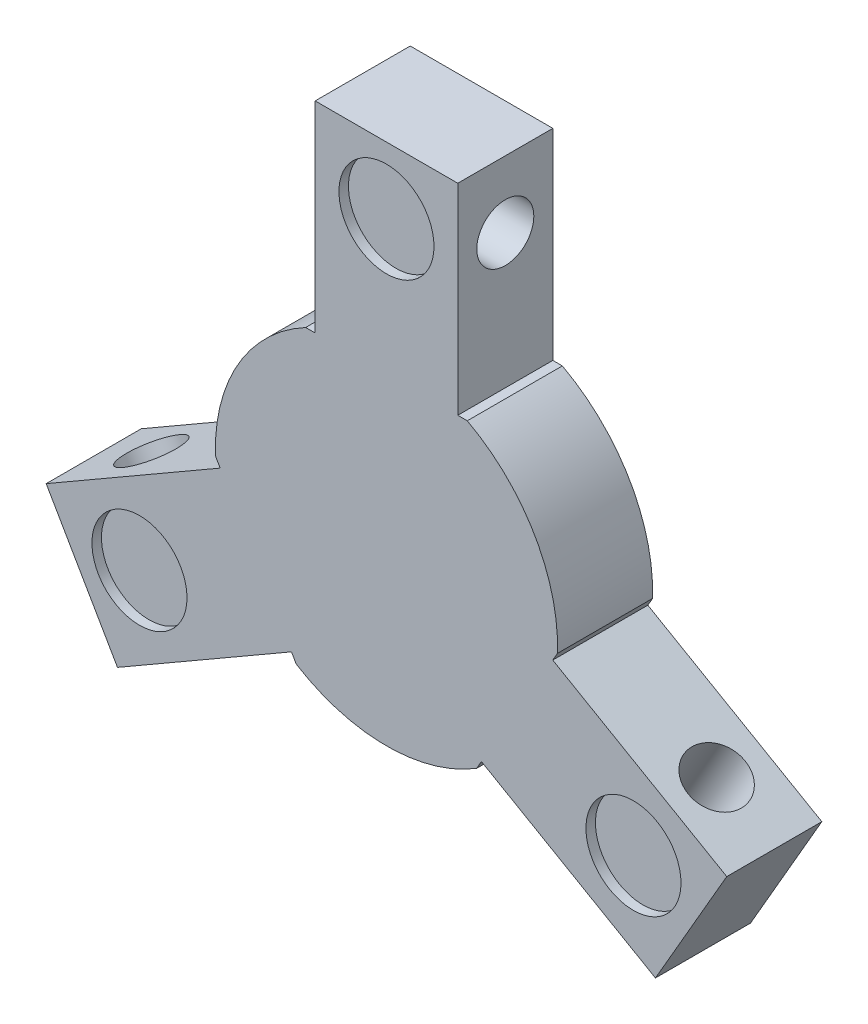
ISO-10303-21;
HEADER;
FILE_DESCRIPTION(('STEP AP214'),'2;1');
FILE_NAME('part.step','',(''),(''),'','','');
FILE_SCHEMA(('AUTOMOTIVE_DESIGN { 1 0 10303 214 1 1 1 1 }'));
ENDSEC;
DATA;
#1=APPLICATION_CONTEXT('core data for automotive mechanical design processes');
#2=APPLICATION_PROTOCOL_DEFINITION('international standard','automotive_design',2000,#1);
#3=PRODUCT_CONTEXT('',#1,'mechanical');
#4=PRODUCT('Part','Part','',(#3));
#5=PRODUCT_RELATED_PRODUCT_CATEGORY('part','',(#4));
#6=PRODUCT_DEFINITION_FORMATION('','',#4);
#7=PRODUCT_DEFINITION_CONTEXT('part definition',#1,'design');
#8=PRODUCT_DEFINITION('design','',#6,#7);
#9=PRODUCT_DEFINITION_SHAPE('','',#8);
#10=(LENGTH_UNIT() NAMED_UNIT(*) SI_UNIT(.MILLI.,.METRE.));
#11=(NAMED_UNIT(*) PLANE_ANGLE_UNIT() SI_UNIT($,.RADIAN.));
#12=(NAMED_UNIT(*) SI_UNIT($,.STERADIAN.) SOLID_ANGLE_UNIT());
#13=UNCERTAINTY_MEASURE_WITH_UNIT(LENGTH_MEASURE(1.E-05),#10,'distance_accuracy_value','');
#14=(GEOMETRIC_REPRESENTATION_CONTEXT(3) GLOBAL_UNCERTAINTY_ASSIGNED_CONTEXT((#13)) GLOBAL_UNIT_ASSIGNED_CONTEXT((#10,
#11,#12)) REPRESENTATION_CONTEXT('',''));
#15=CARTESIAN_POINT('',(0.,0.,0.));
#16=DIRECTION('',(0.,0.,1.));
#17=DIRECTION('',(1.,0.,0.));
#18=AXIS2_PLACEMENT_3D('',#15,#16,#17);
#19=CARTESIAN_POINT('',(0.,0.,5.));
#20=DIRECTION('',(0.,0.,-1.));
#21=DIRECTION('',(-1.,0.,0.));
#22=AXIS2_PLACEMENT_3D('',#19,#20,#21);
#23=CYLINDRICAL_SURFACE('',#22,9.);
#24=CARTESIAN_POINT('',(0.,0.,0.));
#25=DIRECTION('',(0.,0.,1.));
#26=DIRECTION('',(1.,0.,0.));
#27=AXIS2_PLACEMENT_3D('',#24,#25,#26);
#28=CIRCLE('',#27,9.);
#29=CARTESIAN_POINT('',(8.99545304183064,-0.286049947071782,0.));
#30=VERTEX_POINT('',#29);
#31=CARTESIAN_POINT('',(4.25,7.93331582631121,0.));
#32=VERTEX_POINT('',#31);
#33=EDGE_CURVE('E315',#30,#32,#28,.T.);
#34=ORIENTED_EDGE('',*,*,#33,.T.);
#35=DIRECTION('',(0.,0.,1.));
#36=VECTOR('',#35,1.);
#37=CARTESIAN_POINT('',(4.25,7.93331582631121,-5.));
#38=LINE('',#37,#36);
#39=CARTESIAN_POINT('',(4.25,7.93331582631121,5.));
#40=VERTEX_POINT('',#39);
#41=EDGE_CURVE('E301',#32,#40,#38,.T.);
#42=ORIENTED_EDGE('',*,*,#41,.T.);
#43=CARTESIAN_POINT('',(0.,0.,5.));
#44=DIRECTION('',(0.,0.,1.));
#45=DIRECTION('',(1.,0.,0.));
#46=AXIS2_PLACEMENT_3D('',#43,#44,#45);
#47=CIRCLE('',#46,9.);
#48=CARTESIAN_POINT('',(8.99545304183064,-0.286049947071782,5.));
#49=VERTEX_POINT('',#48);
#50=EDGE_CURVE('E316',#49,#40,#47,.T.);
#51=ORIENTED_EDGE('',*,*,#50,.F.);
#52=DIRECTION('',(0.,0.,1.));
#53=VECTOR('',#52,1.);
#54=CARTESIAN_POINT('',(8.99545304183064,-0.286049947071782,-5.));
#55=LINE('',#54,#53);
#56=EDGE_CURVE('E308',#30,#49,#55,.T.);
#57=ORIENTED_EDGE('',*,*,#56,.F.);
#58=EDGE_LOOP('',(#34,#42,#51,#57));
#59=FACE_BOUND('',#58,.T.);
#60=ADVANCED_FACE('F37',(#59),#23,.T.);
#61=CARTESIAN_POINT('',(0.,0.,5.));
#62=DIRECTION('',(0.,0.,-1.));
#63=DIRECTION('',(-1.,0.,0.));
#64=AXIS2_PLACEMENT_3D('',#61,#62,#63);
#65=CYLINDRICAL_SURFACE('',#64,9.);
#66=CARTESIAN_POINT('',(0.,0.,0.));
#67=DIRECTION('',(0.,0.,1.));
#68=DIRECTION('',(1.,0.,0.));
#69=AXIS2_PLACEMENT_3D('',#66,#67,#68);
#70=CIRCLE('',#69,9.);
#71=CARTESIAN_POINT('',(-4.25,7.93331582631121,0.));
#72=VERTEX_POINT('',#71);
#73=CARTESIAN_POINT('',(-8.99545304183065,-0.286049947071653,0.));
#74=VERTEX_POINT('',#73);
#75=EDGE_CURVE('E324',#72,#74,#70,.T.);
#76=ORIENTED_EDGE('',*,*,#75,.T.);
#77=DIRECTION('',(0.,0.,1.));
#78=VECTOR('',#77,1.);
#79=CARTESIAN_POINT('',(-8.99545304183065,-0.286049947071653,-5.));
#80=LINE('',#79,#78);
#81=CARTESIAN_POINT('',(-8.99545304183065,-0.286049947071653,5.));
#82=VERTEX_POINT('',#81);
#83=EDGE_CURVE('E305',#74,#82,#80,.T.);
#84=ORIENTED_EDGE('',*,*,#83,.T.);
#85=CARTESIAN_POINT('',(0.,0.,5.));
#86=DIRECTION('',(0.,0.,1.));
#87=DIRECTION('',(1.,0.,0.));
#88=AXIS2_PLACEMENT_3D('',#85,#86,#87);
#89=CIRCLE('',#88,9.);
#90=CARTESIAN_POINT('',(-4.25,7.93331582631121,5.));
#91=VERTEX_POINT('',#90);
#92=EDGE_CURVE('E45',#91,#82,#89,.T.);
#93=ORIENTED_EDGE('',*,*,#92,.F.);
#94=DIRECTION('',(0.,0.,1.));
#95=VECTOR('',#94,1.);
#96=CARTESIAN_POINT('',(-4.25,7.93331582631121,-5.));
#97=LINE('',#96,#95);
#98=EDGE_CURVE('E304',#72,#91,#97,.T.);
#99=ORIENTED_EDGE('',*,*,#98,.F.);
#100=EDGE_LOOP('',(#76,#84,#93,#99));
#101=FACE_BOUND('',#100,.T.);
#102=ADVANCED_FACE('F366',(#101),#65,.T.);
#103=CARTESIAN_POINT('',(0.,0.,5.));
#104=DIRECTION('',(0.,0.,-1.));
#105=DIRECTION('',(-1.,0.,0.));
#106=AXIS2_PLACEMENT_3D('',#103,#104,#105);
#107=CYLINDRICAL_SURFACE('',#106,9.);
#108=CARTESIAN_POINT('',(0.,0.,0.));
#109=DIRECTION('',(0.,0.,1.));
#110=DIRECTION('',(1.,0.,0.));
#111=AXIS2_PLACEMENT_3D('',#108,#109,#110);
#112=CIRCLE('',#111,9.);
#113=CARTESIAN_POINT('',(-4.74545304183072,-7.64726587923942,0.));
#114=VERTEX_POINT('',#113);
#115=CARTESIAN_POINT('',(4.74545304183061,-7.64726587923949,0.));
#116=VERTEX_POINT('',#115);
#117=EDGE_CURVE('E319',#114,#116,#112,.T.);
#118=ORIENTED_EDGE('',*,*,#117,.T.);
#119=DIRECTION('',(0.,0.,1.));
#120=VECTOR('',#119,1.);
#121=CARTESIAN_POINT('',(4.74545304183061,-7.64726587923949,-5.));
#122=LINE('',#121,#120);
#123=CARTESIAN_POINT('',(4.74545304183061,-7.64726587923949,5.));
#124=VERTEX_POINT('',#123);
#125=EDGE_CURVE('E310',#116,#124,#122,.T.);
#126=ORIENTED_EDGE('',*,*,#125,.T.);
#127=CARTESIAN_POINT('',(0.,0.,5.));
#128=DIRECTION('',(0.,0.,1.));
#129=DIRECTION('',(1.,0.,0.));
#130=AXIS2_PLACEMENT_3D('',#127,#128,#129);
#131=CIRCLE('',#130,9.);
#132=CARTESIAN_POINT('',(-4.74545304183072,-7.64726587923942,5.));
#133=VERTEX_POINT('',#132);
#134=EDGE_CURVE('E11',#133,#124,#131,.T.);
#135=ORIENTED_EDGE('',*,*,#134,.F.);
#136=DIRECTION('',(0.,0.,1.));
#137=VECTOR('',#136,1.);
#138=CARTESIAN_POINT('',(-4.74545304183072,-7.64726587923942,-5.));
#139=LINE('',#138,#137);
#140=EDGE_CURVE('E285',#114,#133,#139,.T.);
#141=ORIENTED_EDGE('',*,*,#140,.F.);
#142=EDGE_LOOP('',(#118,#126,#135,#141));
#143=FACE_BOUND('',#142,.T.);
#144=ADVANCED_FACE('F371',(#143),#107,.T.);
#145=CARTESIAN_POINT('',(0.,0.,5.));
#146=DIRECTION('',(0.,0.,1.));
#147=DIRECTION('',(1.,0.,0.));
#148=AXIS2_PLACEMENT_3D('',#145,#146,#147);
#149=PLANE('',#148);
#150=DIRECTION('',(-0.500000000000004,-0.866025403784436,0.));
#151=VECTOR('',#150,1.);
#152=CARTESIAN_POINT('',(8.74545304183064,-0.719062648964,5.));
#153=LINE('',#152,#151);
#154=CARTESIAN_POINT('',(8.74545304183064,-0.719062648964,5.));
#155=VERTEX_POINT('',#154);
#156=EDGE_CURVE('E217',#49,#155,#153,.T.);
#157=ORIENTED_EDGE('',*,*,#156,.F.);
#158=ORIENTED_EDGE('',*,*,#50,.T.);
#159=DIRECTION('',(1.,0.,0.));
#160=VECTOR('',#159,1.);
#161=CARTESIAN_POINT('',(4.25,7.93331582631121,5.));
#162=LINE('',#161,#160);
#163=CARTESIAN_POINT('',(3.75,7.93331582631121,5.));
#164=VERTEX_POINT('',#163);
#165=EDGE_CURVE('E261',#164,#40,#162,.T.);
#166=ORIENTED_EDGE('',*,*,#165,.F.);
#167=DIRECTION('',(0.,-1.,0.));
#168=VECTOR('',#167,1.);
#169=CARTESIAN_POINT('',(3.75,18.0033147735479,5.));
#170=LINE('',#169,#168);
#171=CARTESIAN_POINT('',(3.75,18.5033147735479,5.));
#172=VERTEX_POINT('',#171);
#173=EDGE_CURVE('E264',#172,#164,#170,.T.);
#174=ORIENTED_EDGE('',*,*,#173,.F.);
#175=DIRECTION('',(-1.,0.,0.));
#176=VECTOR('',#175,1.);
#177=CARTESIAN_POINT('',(-3.75,18.5033147735479,5.));
#178=LINE('',#177,#176);
#179=CARTESIAN_POINT('',(-3.75,18.5033147735479,5.));
#180=VERTEX_POINT('',#179);
#181=EDGE_CURVE('E205',#172,#180,#178,.T.);
#182=ORIENTED_EDGE('',*,*,#181,.T.);
#183=DIRECTION('',(0.,1.,0.));
#184=VECTOR('',#183,1.);
#185=CARTESIAN_POINT('',(-3.75,7.93331582631121,5.));
#186=LINE('',#185,#184);
#187=CARTESIAN_POINT('',(-3.75,7.93331582631121,5.));
#188=VERTEX_POINT('',#187);
#189=EDGE_CURVE('E249',#188,#180,#186,.T.);
#190=ORIENTED_EDGE('',*,*,#189,.F.);
#191=DIRECTION('',(1.,0.,0.));
#192=VECTOR('',#191,1.);
#193=CARTESIAN_POINT('',(-3.75,7.93331582631121,5.));
#194=LINE('',#193,#192);
#195=EDGE_CURVE('E251',#91,#188,#194,.T.);
#196=ORIENTED_EDGE('',*,*,#195,.F.);
#197=ORIENTED_EDGE('',*,*,#92,.T.);
#198=DIRECTION('',(-0.499999999999994,0.866025403784442,0.));
#199=VECTOR('',#198,1.);
#200=CARTESIAN_POINT('',(-8.74545304183065,-0.719062648963874,5.));
#201=LINE('',#200,#199);
#202=CARTESIAN_POINT('',(-8.74545304183065,-0.719062648963874,5.));
#203=VERTEX_POINT('',#202);
#204=EDGE_CURVE('E224',#203,#82,#201,.T.);
#205=ORIENTED_EDGE('',*,*,#204,.F.);
#206=DIRECTION('',(0.866025403784443,0.499999999999992,0.));
#207=VECTOR('',#206,1.);
#208=CARTESIAN_POINT('',(-17.4634572681199,-5.75240473580819,5.));
#209=LINE('',#208,#207);
#210=CARTESIAN_POINT('',(-17.8964699700122,-6.00240473580819,5.));
#211=VERTEX_POINT('',#210);
#212=EDGE_CURVE('E228',#211,#203,#209,.T.);
#213=ORIENTED_EDGE('',*,*,#212,.F.);
#214=DIRECTION('',(0.499999999999992,-0.866025403784443,0.));
#215=VECTOR('',#214,1.);
#216=CARTESIAN_POINT('',(-17.8964699700122,-6.00240473580819,5.));
#217=LINE('',#216,#215);
#218=CARTESIAN_POINT('',(-14.1464699700122,-12.4975952641915,5.));
#219=VERTEX_POINT('',#218);
#220=EDGE_CURVE('E194',#211,#219,#217,.T.);
#221=ORIENTED_EDGE('',*,*,#220,.T.);
#222=DIRECTION('',(-0.866025403784443,-0.499999999999992,0.));
#223=VECTOR('',#222,1.);
#224=CARTESIAN_POINT('',(-4.99545304183071,-7.2142531773472,5.));
#225=LINE('',#224,#223);
#226=CARTESIAN_POINT('',(-4.99545304183071,-7.2142531773472,5.));
#227=VERTEX_POINT('',#226);
#228=EDGE_CURVE('E237',#227,#219,#225,.T.);
#229=ORIENTED_EDGE('',*,*,#228,.F.);
#230=DIRECTION('',(-0.499999999999992,0.866025403784443,0.));
#231=VECTOR('',#230,1.);
#232=CARTESIAN_POINT('',(-4.74545304183072,-7.64726587923942,5.));
#233=LINE('',#232,#231);
#234=EDGE_CURVE('E239',#133,#227,#233,.T.);
#235=ORIENTED_EDGE('',*,*,#234,.F.);
#236=ORIENTED_EDGE('',*,*,#134,.T.);
#237=DIRECTION('',(-0.500000000000003,-0.866025403784437,0.));
#238=VECTOR('',#237,1.);
#239=CARTESIAN_POINT('',(4.99545304183061,-7.21425317734727,5.));
#240=LINE('',#239,#238);
#241=CARTESIAN_POINT('',(4.99545304183061,-7.21425317734727,5.));
#242=VERTEX_POINT('',#241);
#243=EDGE_CURVE('E176',#242,#124,#240,.T.);
#244=ORIENTED_EDGE('',*,*,#243,.F.);
#245=DIRECTION('',(-0.866025403784436,0.500000000000004,0.));
#246=VECTOR('',#245,1.);
#247=CARTESIAN_POINT('',(13.7134572681198,-12.2475952641917,5.));
#248=LINE('',#247,#246);
#249=CARTESIAN_POINT('',(14.1464699700121,-12.4975952641917,5.));
#250=VERTEX_POINT('',#249);
#251=EDGE_CURVE('E234',#250,#242,#248,.T.);
#252=ORIENTED_EDGE('',*,*,#251,.F.);
#253=DIRECTION('',(0.500000000000005,0.866025403784435,0.));
#254=VECTOR('',#253,1.);
#255=CARTESIAN_POINT('',(17.8964699700121,-6.00240473580845,5.));
#256=LINE('',#255,#254);
#257=CARTESIAN_POINT('',(17.8964699700121,-6.00240473580845,5.));
#258=VERTEX_POINT('',#257);
#259=EDGE_CURVE('E184',#250,#258,#256,.T.);
#260=ORIENTED_EDGE('',*,*,#259,.T.);
#261=DIRECTION('',(0.866025403784436,-0.500000000000004,0.));
#262=VECTOR('',#261,1.);
#263=CARTESIAN_POINT('',(8.74545304183064,-0.719062648964,5.));
#264=LINE('',#263,#262);
#265=EDGE_CURVE('E271',#155,#258,#264,.T.);
#266=ORIENTED_EDGE('',*,*,#265,.F.);
#267=EDGE_LOOP('',(#157,#158,#166,#174,#182,#190,#196,#197,#205,#213,#221,#229,#235,#236,#244,
#252,#260,#266));
#268=FACE_BOUND('',#267,.T.);
#269=CARTESIAN_POINT('',(0.,15.,5.));
#270=DIRECTION('',(0.,0.,1.));
#271=DIRECTION('',(1.,0.,0.));
#272=AXIS2_PLACEMENT_3D('',#269,#270,#271);
#273=CIRCLE('',#272,2.5);
#274=CARTESIAN_POINT('',(2.5,15.,5.));
#275=VERTEX_POINT('',#274);
#276=EDGE_CURVE('E286',#275,#275,#273,.T.);
#277=ORIENTED_EDGE('',*,*,#276,.F.);
#278=EDGE_LOOP('',(#277));
#279=FACE_BOUND('',#278,.T.);
#280=CARTESIAN_POINT('',(12.9903810567665,-7.50000000000006,5.));
#281=DIRECTION('',(0.,0.,1.));
#282=DIRECTION('',(1.,0.,0.));
#283=AXIS2_PLACEMENT_3D('',#280,#281,#282);
#284=CIRCLE('',#283,2.5);
#285=CARTESIAN_POINT('',(15.4903810567665,-7.50000000000006,5.));
#286=VERTEX_POINT('',#285);
#287=EDGE_CURVE('E292',#286,#286,#284,.T.);
#288=ORIENTED_EDGE('',*,*,#287,.F.);
#289=EDGE_LOOP('',(#288));
#290=FACE_BOUND('',#289,.T.);
#291=CARTESIAN_POINT('',(-12.9903810567667,-7.49999999999988,5.));
#292=DIRECTION('',(0.,0.,1.));
#293=DIRECTION('',(1.,0.,0.));
#294=AXIS2_PLACEMENT_3D('',#291,#292,#293);
#295=CIRCLE('',#294,2.5);
#296=CARTESIAN_POINT('',(-10.4903810567667,-7.49999999999988,5.));
#297=VERTEX_POINT('',#296);
#298=EDGE_CURVE('E298',#297,#297,#295,.T.);
#299=ORIENTED_EDGE('',*,*,#298,.F.);
#300=EDGE_LOOP('',(#299));
#301=FACE_BOUND('',#300,.T.);
#302=ADVANCED_FACE('F380',(#268,#279,#290,#301),#149,.T.);
#303=CARTESIAN_POINT('',(0.,0.,0.));
#304=DIRECTION('',(0.,0.,1.));
#305=DIRECTION('',(1.,0.,0.));
#306=AXIS2_PLACEMENT_3D('',#303,#304,#305);
#307=PLANE('',#306);
#308=ORIENTED_EDGE('',*,*,#33,.F.);
#309=DIRECTION('',(-0.500000000000004,-0.866025403784436,0.));
#310=VECTOR('',#309,1.);
#311=CARTESIAN_POINT('',(8.74545304183064,-0.719062648964,0.));
#312=LINE('',#311,#310);
#313=CARTESIAN_POINT('',(8.74545304183064,-0.719062648964,0.));
#314=VERTEX_POINT('',#313);
#315=EDGE_CURVE('E61',#30,#314,#312,.T.);
#316=ORIENTED_EDGE('',*,*,#315,.T.);
#317=DIRECTION('',(0.866025403784436,-0.500000000000004,0.));
#318=VECTOR('',#317,1.);
#319=CARTESIAN_POINT('',(8.74545304183064,-0.719062648964,0.));
#320=LINE('',#319,#318);
#321=CARTESIAN_POINT('',(17.8964699700121,-6.00240473580845,0.));
#322=VERTEX_POINT('',#321);
#323=EDGE_CURVE('E189',#314,#322,#320,.T.);
#324=ORIENTED_EDGE('',*,*,#323,.T.);
#325=DIRECTION('',(0.500000000000005,0.866025403784435,0.));
#326=VECTOR('',#325,1.);
#327=CARTESIAN_POINT('',(17.8964699700121,-6.00240473580845,0.));
#328=LINE('',#327,#326);
#329=CARTESIAN_POINT('',(14.1464699700121,-12.4975952641917,0.));
#330=VERTEX_POINT('',#329);
#331=EDGE_CURVE('E182',#330,#322,#328,.T.);
#332=ORIENTED_EDGE('',*,*,#331,.F.);
#333=DIRECTION('',(-0.866025403784436,0.500000000000004,0.));
#334=VECTOR('',#333,1.);
#335=CARTESIAN_POINT('',(13.7134572681198,-12.2475952641917,0.));
#336=LINE('',#335,#334);
#337=CARTESIAN_POINT('',(4.99545304183061,-7.21425317734727,0.));
#338=VERTEX_POINT('',#337);
#339=EDGE_CURVE('E163',#330,#338,#336,.T.);
#340=ORIENTED_EDGE('',*,*,#339,.T.);
#341=DIRECTION('',(-0.500000000000003,-0.866025403784437,0.));
#342=VECTOR('',#341,1.);
#343=CARTESIAN_POINT('',(4.99545304183061,-7.21425317734727,0.));
#344=LINE('',#343,#342);
#345=EDGE_CURVE('E175',#338,#116,#344,.T.);
#346=ORIENTED_EDGE('',*,*,#345,.T.);
#347=ORIENTED_EDGE('',*,*,#117,.F.);
#348=DIRECTION('',(-0.499999999999992,0.866025403784443,0.));
#349=VECTOR('',#348,1.);
#350=CARTESIAN_POINT('',(-4.74545304183072,-7.64726587923942,0.));
#351=LINE('',#350,#349);
#352=CARTESIAN_POINT('',(-4.99545304183071,-7.2142531773472,0.));
#353=VERTEX_POINT('',#352);
#354=EDGE_CURVE('E53',#114,#353,#351,.T.);
#355=ORIENTED_EDGE('',*,*,#354,.T.);
#356=DIRECTION('',(-0.866025403784443,-0.499999999999992,0.));
#357=VECTOR('',#356,1.);
#358=CARTESIAN_POINT('',(-4.99545304183071,-7.2142531773472,0.));
#359=LINE('',#358,#357);
#360=CARTESIAN_POINT('',(-14.1464699700122,-12.4975952641915,0.));
#361=VERTEX_POINT('',#360);
#362=EDGE_CURVE('E236',#353,#361,#359,.T.);
#363=ORIENTED_EDGE('',*,*,#362,.T.);
#364=DIRECTION('',(0.499999999999992,-0.866025403784443,0.));
#365=VECTOR('',#364,1.);
#366=CARTESIAN_POINT('',(-17.8964699700122,-6.00240473580819,0.));
#367=LINE('',#366,#365);
#368=CARTESIAN_POINT('',(-17.8964699700122,-6.00240473580819,0.));
#369=VERTEX_POINT('',#368);
#370=EDGE_CURVE('E196',#369,#361,#367,.T.);
#371=ORIENTED_EDGE('',*,*,#370,.F.);
#372=DIRECTION('',(0.866025403784443,0.499999999999992,0.));
#373=VECTOR('',#372,1.);
#374=CARTESIAN_POINT('',(-17.4634572681199,-5.75240473580819,0.));
#375=LINE('',#374,#373);
#376=CARTESIAN_POINT('',(-8.74545304183065,-0.719062648963874,0.));
#377=VERTEX_POINT('',#376);
#378=EDGE_CURVE('E220',#369,#377,#375,.T.);
#379=ORIENTED_EDGE('',*,*,#378,.T.);
#380=DIRECTION('',(-0.499999999999994,0.866025403784442,0.));
#381=VECTOR('',#380,1.);
#382=CARTESIAN_POINT('',(-8.74545304183065,-0.719062648963874,0.));
#383=LINE('',#382,#381);
#384=EDGE_CURVE('E223',#377,#74,#383,.T.);
#385=ORIENTED_EDGE('',*,*,#384,.T.);
#386=ORIENTED_EDGE('',*,*,#75,.F.);
#387=DIRECTION('',(1.,0.,0.));
#388=VECTOR('',#387,1.);
#389=CARTESIAN_POINT('',(-3.75,7.93331582631121,0.));
#390=LINE('',#389,#388);
#391=CARTESIAN_POINT('',(-3.75,7.93331582631121,0.));
#392=VERTEX_POINT('',#391);
#393=EDGE_CURVE('E245',#72,#392,#390,.T.);
#394=ORIENTED_EDGE('',*,*,#393,.T.);
#395=DIRECTION('',(0.,1.,0.));
#396=VECTOR('',#395,1.);
#397=CARTESIAN_POINT('',(-3.75,7.93331582631121,0.));
#398=LINE('',#397,#396);
#399=CARTESIAN_POINT('',(-3.75,18.5033147735479,0.));
#400=VERTEX_POINT('',#399);
#401=EDGE_CURVE('E248',#392,#400,#398,.T.);
#402=ORIENTED_EDGE('',*,*,#401,.T.);
#403=DIRECTION('',(-1.,0.,0.));
#404=VECTOR('',#403,1.);
#405=CARTESIAN_POINT('',(-3.75,18.5033147735479,0.));
#406=LINE('',#405,#404);
#407=CARTESIAN_POINT('',(3.75,18.5033147735479,0.));
#408=VERTEX_POINT('',#407);
#409=EDGE_CURVE('E208',#408,#400,#406,.T.);
#410=ORIENTED_EDGE('',*,*,#409,.F.);
#411=DIRECTION('',(0.,-1.,0.));
#412=VECTOR('',#411,1.);
#413=CARTESIAN_POINT('',(3.75,18.0033147735479,0.));
#414=LINE('',#413,#412);
#415=CARTESIAN_POINT('',(3.75,7.93331582631121,0.));
#416=VERTEX_POINT('',#415);
#417=EDGE_CURVE('E257',#408,#416,#414,.T.);
#418=ORIENTED_EDGE('',*,*,#417,.T.);
#419=DIRECTION('',(1.,0.,0.));
#420=VECTOR('',#419,1.);
#421=CARTESIAN_POINT('',(4.25,7.93331582631121,0.));
#422=LINE('',#421,#420);
#423=EDGE_CURVE('E260',#416,#32,#422,.T.);
#424=ORIENTED_EDGE('',*,*,#423,.T.);
#425=EDGE_LOOP('',(#308,#316,#324,#332,#340,#346,#347,#355,#363,#371,#379,#385,#386,#394,#402,
#410,#418,#424));
#426=FACE_BOUND('',#425,.T.);
#427=ADVANCED_FACE('F187',(#426),#307,.F.);
#428=CARTESIAN_POINT('',(-12.9903810567667,-7.49999999999988,4.5));
#429=DIRECTION('',(0.,0.,1.));
#430=DIRECTION('',(1.,0.,0.));
#431=AXIS2_PLACEMENT_3D('',#428,#429,#430);
#432=CYLINDRICAL_SURFACE('',#431,2.5);
#433=CARTESIAN_POINT('',(-12.9903810567667,-7.49999999999988,4.5));
#434=DIRECTION('',(0.,0.,1.));
#435=DIRECTION('',(1.,0.,0.));
#436=AXIS2_PLACEMENT_3D('',#433,#434,#435);
#437=CIRCLE('',#436,2.5);
#438=CARTESIAN_POINT('',(-10.4903810567667,-7.49999999999988,4.5));
#439=VERTEX_POINT('',#438);
#440=EDGE_CURVE('E295',#439,#439,#437,.T.);
#441=ORIENTED_EDGE('',*,*,#440,.F.);
#442=EDGE_LOOP('',(#441));
#443=FACE_BOUND('',#442,.T.);
#444=ORIENTED_EDGE('',*,*,#298,.T.);
#445=EDGE_LOOP('',(#444));
#446=FACE_BOUND('',#445,.T.);
#447=ADVANCED_FACE('F477',(#443,#446),#432,.F.);
#448=CARTESIAN_POINT('',(-12.9903810567667,-7.49999999999988,4.5));
#449=DIRECTION('',(0.,0.,1.));
#450=DIRECTION('',(1.,0.,0.));
#451=AXIS2_PLACEMENT_3D('',#448,#449,#450);
#452=PLANE('',#451);
#453=ORIENTED_EDGE('',*,*,#440,.T.);
#454=EDGE_LOOP('',(#453));
#455=FACE_BOUND('',#454,.T.);
#456=ADVANCED_FACE('F473',(#455),#452,.T.);
#457=CARTESIAN_POINT('',(12.9903810567665,-7.50000000000006,4.5));
#458=DIRECTION('',(0.,0.,1.));
#459=DIRECTION('',(1.,0.,0.));
#460=AXIS2_PLACEMENT_3D('',#457,#458,#459);
#461=CYLINDRICAL_SURFACE('',#460,2.5);
#462=CARTESIAN_POINT('',(12.9903810567665,-7.50000000000006,4.5));
#463=DIRECTION('',(0.,0.,1.));
#464=DIRECTION('',(1.,0.,0.));
#465=AXIS2_PLACEMENT_3D('',#462,#463,#464);
#466=CIRCLE('',#465,2.5);
#467=CARTESIAN_POINT('',(15.4903810567665,-7.50000000000006,4.5));
#468=VERTEX_POINT('',#467);
#469=EDGE_CURVE('E289',#468,#468,#466,.T.);
#470=ORIENTED_EDGE('',*,*,#469,.F.);
#471=EDGE_LOOP('',(#470));
#472=FACE_BOUND('',#471,.T.);
#473=ORIENTED_EDGE('',*,*,#287,.T.);
#474=EDGE_LOOP('',(#473));
#475=FACE_BOUND('',#474,.T.);
#476=ADVANCED_FACE('F469',(#472,#475),#461,.F.);
#477=CARTESIAN_POINT('',(12.9903810567665,-7.50000000000006,4.5));
#478=DIRECTION('',(0.,0.,1.));
#479=DIRECTION('',(1.,0.,0.));
#480=AXIS2_PLACEMENT_3D('',#477,#478,#479);
#481=PLANE('',#480);
#482=ORIENTED_EDGE('',*,*,#469,.T.);
#483=EDGE_LOOP('',(#482));
#484=FACE_BOUND('',#483,.T.);
#485=ADVANCED_FACE('F465',(#484),#481,.T.);
#486=CARTESIAN_POINT('',(0.,15.,4.5));
#487=DIRECTION('',(0.,0.,1.));
#488=DIRECTION('',(1.,0.,0.));
#489=AXIS2_PLACEMENT_3D('',#486,#487,#488);
#490=CYLINDRICAL_SURFACE('',#489,2.5);
#491=CARTESIAN_POINT('',(0.,15.,4.5));
#492=DIRECTION('',(0.,0.,1.));
#493=DIRECTION('',(1.,0.,0.));
#494=AXIS2_PLACEMENT_3D('',#491,#492,#493);
#495=CIRCLE('',#494,2.5);
#496=CARTESIAN_POINT('',(2.5,15.,4.5));
#497=VERTEX_POINT('',#496);
#498=EDGE_CURVE('E282',#497,#497,#495,.T.);
#499=ORIENTED_EDGE('',*,*,#498,.F.);
#500=EDGE_LOOP('',(#499));
#501=FACE_BOUND('',#500,.T.);
#502=ORIENTED_EDGE('',*,*,#276,.T.);
#503=EDGE_LOOP('',(#502));
#504=FACE_BOUND('',#503,.T.);
#505=ADVANCED_FACE('F461',(#501,#504),#490,.F.);
#506=CARTESIAN_POINT('',(0.,15.,4.5));
#507=DIRECTION('',(0.,0.,1.));
#508=DIRECTION('',(1.,0.,0.));
#509=AXIS2_PLACEMENT_3D('',#506,#507,#508);
#510=PLANE('',#509);
#511=ORIENTED_EDGE('',*,*,#498,.T.);
#512=EDGE_LOOP('',(#511));
#513=FACE_BOUND('',#512,.T.);
#514=ADVANCED_FACE('F441',(#513),#510,.T.);
#515=CARTESIAN_POINT('',(-17.4634572681199,-5.75240473580819,0.));
#516=DIRECTION('',(0.499999999999992,-0.866025403784443,0.));
#517=DIRECTION('',(0.866025403784443,0.499999999999992,0.));
#518=AXIS2_PLACEMENT_3D('',#515,#516,#517);
#519=PLANE('',#518);
#520=ORIENTED_EDGE('',*,*,#212,.T.);
#521=DIRECTION('',(0.,0.,1.));
#522=VECTOR('',#521,1.);
#523=CARTESIAN_POINT('',(-8.74545304183065,-0.719062648963874,0.));
#524=LINE('',#523,#522);
#525=EDGE_CURVE('E227',#377,#203,#524,.T.);
#526=ORIENTED_EDGE('',*,*,#525,.F.);
#527=ORIENTED_EDGE('',*,*,#378,.F.);
#528=DIRECTION('',(0.,0.,1.));
#529=VECTOR('',#528,1.);
#530=CARTESIAN_POINT('',(-17.8964699700122,-6.00240473580819,0.));
#531=LINE('',#530,#529);
#532=EDGE_CURVE('E199',#369,#211,#531,.T.);
#533=ORIENTED_EDGE('',*,*,#532,.T.);
#534=EDGE_LOOP('',(#520,#526,#527,#533));
#535=FACE_BOUND('',#534,.T.);
#536=CARTESIAN_POINT('',(-14.8653810567666,-4.25240473580822,2.5));
#537=DIRECTION('',(0.499999999999992,-0.866025403784443,0.));
#538=DIRECTION('',(0.866025403784443,0.499999999999992,0.));
#539=AXIS2_PLACEMENT_3D('',#536,#537,#538);
#540=CIRCLE('',#539,1.5);
#541=CARTESIAN_POINT('',(-13.56634295109,-3.50240473580823,2.5));
#542=VERTEX_POINT('',#541);
#543=EDGE_CURVE('E281',#542,#542,#540,.F.);
#544=ORIENTED_EDGE('',*,*,#543,.F.);
#545=EDGE_LOOP('',(#544));
#546=FACE_BOUND('',#545,.T.);
#547=ADVANCED_FACE('F409',(#535,#546),#519,.F.);
#548=CARTESIAN_POINT('',(-8.74545304183065,-0.719062648963874,0.));
#549=DIRECTION('',(0.866025403784442,0.499999999999994,0.));
#550=DIRECTION('',(-0.499999999999994,0.866025403784442,0.));
#551=AXIS2_PLACEMENT_3D('',#548,#549,#550);
#552=PLANE('',#551);
#553=ORIENTED_EDGE('',*,*,#204,.T.);
#554=ORIENTED_EDGE('',*,*,#83,.F.);
#555=ORIENTED_EDGE('',*,*,#384,.F.);
#556=ORIENTED_EDGE('',*,*,#525,.T.);
#557=EDGE_LOOP('',(#553,#554,#555,#556));
#558=FACE_BOUND('',#557,.T.);
#559=ADVANCED_FACE('F413',(#558),#552,.F.);
#560=CARTESIAN_POINT('',(-4.99545304183071,-7.2142531773472,0.));
#561=DIRECTION('',(-0.499999999999992,0.866025403784443,0.));
#562=DIRECTION('',(-0.866025403784443,-0.499999999999992,0.));
#563=AXIS2_PLACEMENT_3D('',#560,#561,#562);
#564=PLANE('',#563);
#565=ORIENTED_EDGE('',*,*,#228,.T.);
#566=DIRECTION('',(0.,0.,1.));
#567=VECTOR('',#566,1.);
#568=CARTESIAN_POINT('',(-14.1464699700122,-12.4975952641915,0.));
#569=LINE('',#568,#567);
#570=EDGE_CURVE('E202',#361,#219,#569,.T.);
#571=ORIENTED_EDGE('',*,*,#570,.F.);
#572=ORIENTED_EDGE('',*,*,#362,.F.);
#573=DIRECTION('',(0.,0.,1.));
#574=VECTOR('',#573,1.);
#575=CARTESIAN_POINT('',(-4.99545304183071,-7.2142531773472,0.));
#576=LINE('',#575,#574);
#577=EDGE_CURVE('E231',#353,#227,#576,.T.);
#578=ORIENTED_EDGE('',*,*,#577,.T.);
#579=EDGE_LOOP('',(#565,#571,#572,#578));
#580=FACE_BOUND('',#579,.T.);
#581=CARTESIAN_POINT('',(-11.1153810567667,-10.7475952641915,2.5));
#582=DIRECTION('',(-0.499999999999992,0.866025403784443,0.));
#583=DIRECTION('',(-0.866025403784443,-0.499999999999992,0.));
#584=AXIS2_PLACEMENT_3D('',#581,#582,#583);
#585=CIRCLE('',#584,1.5);
#586=CARTESIAN_POINT('',(-12.4144191624433,-11.4975952641915,2.5));
#587=VERTEX_POINT('',#586);
#588=EDGE_CURVE('E331',#587,#587,#585,.F.);
#589=ORIENTED_EDGE('',*,*,#588,.F.);
#590=EDGE_LOOP('',(#589));
#591=FACE_BOUND('',#590,.T.);
#592=ADVANCED_FACE('F399',(#580,#591),#564,.F.);
#593=CARTESIAN_POINT('',(-4.74545304183072,-7.64726587923942,0.));
#594=DIRECTION('',(0.866025403784443,0.499999999999992,0.));
#595=DIRECTION('',(-0.499999999999992,0.866025403784443,0.));
#596=AXIS2_PLACEMENT_3D('',#593,#594,#595);
#597=PLANE('',#596);
#598=ORIENTED_EDGE('',*,*,#234,.T.);
#599=ORIENTED_EDGE('',*,*,#577,.F.);
#600=ORIENTED_EDGE('',*,*,#354,.F.);
#601=ORIENTED_EDGE('',*,*,#140,.T.);
#602=EDGE_LOOP('',(#598,#599,#600,#601));
#603=FACE_BOUND('',#602,.T.);
#604=ADVANCED_FACE('F394',(#603),#597,.F.);
#605=CARTESIAN_POINT('',(13.7134572681198,-12.2475952641917,0.));
#606=DIRECTION('',(0.500000000000004,0.866025403784436,0.));
#607=DIRECTION('',(-0.866025403784436,0.500000000000004,0.));
#608=AXIS2_PLACEMENT_3D('',#605,#606,#607);
#609=PLANE('',#608);
#610=ORIENTED_EDGE('',*,*,#251,.T.);
#611=DIRECTION('',(0.,0.,1.));
#612=VECTOR('',#611,1.);
#613=CARTESIAN_POINT('',(4.99545304183061,-7.21425317734727,0.));
#614=LINE('',#613,#612);
#615=EDGE_CURVE('E170',#338,#242,#614,.T.);
#616=ORIENTED_EDGE('',*,*,#615,.F.);
#617=ORIENTED_EDGE('',*,*,#339,.F.);
#618=DIRECTION('',(0.,0.,1.));
#619=VECTOR('',#618,1.);
#620=CARTESIAN_POINT('',(14.1464699700121,-12.4975952641917,0.));
#621=LINE('',#620,#619);
#622=EDGE_CURVE('E168',#330,#250,#621,.T.);
#623=ORIENTED_EDGE('',*,*,#622,.T.);
#624=EDGE_LOOP('',(#610,#616,#617,#623));
#625=FACE_BOUND('',#624,.T.);
#626=CARTESIAN_POINT('',(11.1153810567665,-10.7475952641917,2.5));
#627=DIRECTION('',(0.500000000000004,0.866025403784436,0.));
#628=DIRECTION('',(-0.866025403784436,0.500000000000004,0.));
#629=AXIS2_PLACEMENT_3D('',#626,#627,#628);
#630=CIRCLE('',#629,1.5);
#631=CARTESIAN_POINT('',(9.81634295108988,-9.99759526419169,2.5));
#632=VERTEX_POINT('',#631);
#633=EDGE_CURVE('E334',#632,#632,#630,.F.);
#634=ORIENTED_EDGE('',*,*,#633,.F.);
#635=EDGE_LOOP('',(#634));
#636=FACE_BOUND('',#635,.T.);
#637=ADVANCED_FACE('F166',(#625,#636),#609,.F.);
#638=CARTESIAN_POINT('',(4.99545304183061,-7.21425317734727,0.));
#639=DIRECTION('',(-0.866025403784437,0.500000000000003,0.));
#640=DIRECTION('',(-0.500000000000003,-0.866025403784437,0.));
#641=AXIS2_PLACEMENT_3D('',#638,#639,#640);
#642=PLANE('',#641);
#643=ORIENTED_EDGE('',*,*,#243,.T.);
#644=ORIENTED_EDGE('',*,*,#125,.F.);
#645=ORIENTED_EDGE('',*,*,#345,.F.);
#646=ORIENTED_EDGE('',*,*,#615,.T.);
#647=EDGE_LOOP('',(#643,#644,#645,#646));
#648=FACE_BOUND('',#647,.T.);
#649=ADVANCED_FACE('F391',(#648),#642,.F.);
#650=CARTESIAN_POINT('',(8.74545304183064,-0.719062648964,0.));
#651=DIRECTION('',(-0.500000000000004,-0.866025403784436,0.));
#652=DIRECTION('',(0.866025403784436,-0.500000000000004,0.));
#653=AXIS2_PLACEMENT_3D('',#650,#651,#652);
#654=PLANE('',#653);
#655=ORIENTED_EDGE('',*,*,#265,.T.);
#656=DIRECTION('',(0.,0.,1.));
#657=VECTOR('',#656,1.);
#658=CARTESIAN_POINT('',(17.8964699700121,-6.00240473580845,0.));
#659=LINE('',#658,#657);
#660=EDGE_CURVE('E185',#322,#258,#659,.T.);
#661=ORIENTED_EDGE('',*,*,#660,.F.);
#662=ORIENTED_EDGE('',*,*,#323,.F.);
#663=DIRECTION('',(0.,0.,1.));
#664=VECTOR('',#663,1.);
#665=CARTESIAN_POINT('',(8.74545304183064,-0.719062648964,0.));
#666=LINE('',#665,#664);
#667=EDGE_CURVE('E267',#314,#155,#666,.T.);
#668=ORIENTED_EDGE('',*,*,#667,.T.);
#669=EDGE_LOOP('',(#655,#661,#662,#668));
#670=FACE_BOUND('',#669,.T.);
#671=CARTESIAN_POINT('',(14.8653810567666,-4.25240473580843,2.5));
#672=DIRECTION('',(-0.500000000000004,-0.866025403784436,0.));
#673=DIRECTION('',(0.866025403784436,-0.500000000000004,0.));
#674=AXIS2_PLACEMENT_3D('',#671,#672,#673);
#675=CIRCLE('',#674,1.5);
#676=CARTESIAN_POINT('',(16.1644191624432,-5.00240473580843,2.5));
#677=VERTEX_POINT('',#676);
#678=EDGE_CURVE('E337',#677,#677,#675,.F.);
#679=ORIENTED_EDGE('',*,*,#678,.F.);
#680=EDGE_LOOP('',(#679));
#681=FACE_BOUND('',#680,.T.);
#682=ADVANCED_FACE('F385',(#670,#681),#654,.F.);
#683=CARTESIAN_POINT('',(8.74545304183064,-0.719062648964,0.));
#684=DIRECTION('',(-0.866025403784436,0.500000000000004,0.));
#685=DIRECTION('',(-0.500000000000004,-0.866025403784436,0.));
#686=AXIS2_PLACEMENT_3D('',#683,#684,#685);
#687=PLANE('',#686);
#688=ORIENTED_EDGE('',*,*,#156,.T.);
#689=ORIENTED_EDGE('',*,*,#667,.F.);
#690=ORIENTED_EDGE('',*,*,#315,.F.);
#691=ORIENTED_EDGE('',*,*,#56,.T.);
#692=EDGE_LOOP('',(#688,#689,#690,#691));
#693=FACE_BOUND('',#692,.T.);
#694=ADVANCED_FACE('F383',(#693),#687,.F.);
#695=CARTESIAN_POINT('',(-3.75,7.93331582631121,0.));
#696=DIRECTION('',(1.,0.,0.));
#697=DIRECTION('',(0.,0.,-1.));
#698=AXIS2_PLACEMENT_3D('',#695,#696,#697);
#699=PLANE('',#698);
#700=ORIENTED_EDGE('',*,*,#189,.T.);
#701=DIRECTION('',(0.,0.,1.));
#702=VECTOR('',#701,1.);
#703=CARTESIAN_POINT('',(-3.75,18.5033147735479,0.));
#704=LINE('',#703,#702);
#705=EDGE_CURVE('E214',#400,#180,#704,.T.);
#706=ORIENTED_EDGE('',*,*,#705,.F.);
#707=ORIENTED_EDGE('',*,*,#401,.F.);
#708=DIRECTION('',(0.,0.,1.));
#709=VECTOR('',#708,1.);
#710=CARTESIAN_POINT('',(-3.75,7.93331582631121,0.));
#711=LINE('',#710,#709);
#712=EDGE_CURVE('E242',#392,#188,#711,.T.);
#713=ORIENTED_EDGE('',*,*,#712,.T.);
#714=EDGE_LOOP('',(#700,#706,#707,#713));
#715=FACE_BOUND('',#714,.T.);
#716=CARTESIAN_POINT('',(-3.75,15.0033147735479,2.5));
#717=DIRECTION('',(1.,0.,0.));
#718=DIRECTION('',(0.,0.,-1.));
#719=AXIS2_PLACEMENT_3D('',#716,#717,#718);
#720=CIRCLE('',#719,1.5);
#721=CARTESIAN_POINT('',(-3.75,15.0033147735479,0.999999999999999));
#722=VERTEX_POINT('',#721);
#723=EDGE_CURVE('E339',#722,#722,#720,.F.);
#724=ORIENTED_EDGE('',*,*,#723,.F.);
#725=EDGE_LOOP('',(#724));
#726=FACE_BOUND('',#725,.T.);
#727=ADVANCED_FACE('F361',(#715,#726),#699,.F.);
#728=CARTESIAN_POINT('',(-3.75,7.93331582631121,0.));
#729=DIRECTION('',(0.,-1.,0.));
#730=DIRECTION('',(0.,0.,-1.));
#731=AXIS2_PLACEMENT_3D('',#728,#729,#730);
#732=PLANE('',#731);
#733=ORIENTED_EDGE('',*,*,#195,.T.);
#734=ORIENTED_EDGE('',*,*,#712,.F.);
#735=ORIENTED_EDGE('',*,*,#393,.F.);
#736=ORIENTED_EDGE('',*,*,#98,.T.);
#737=EDGE_LOOP('',(#733,#734,#735,#736));
#738=FACE_BOUND('',#737,.T.);
#739=ADVANCED_FACE('F351',(#738),#732,.F.);
#740=CARTESIAN_POINT('',(3.75,18.0033147735479,0.));
#741=DIRECTION('',(-1.,0.,0.));
#742=DIRECTION('',(0.,-1.,0.));
#743=AXIS2_PLACEMENT_3D('',#740,#741,#742);
#744=PLANE('',#743);
#745=ORIENTED_EDGE('',*,*,#173,.T.);
#746=DIRECTION('',(0.,0.,1.));
#747=VECTOR('',#746,1.);
#748=CARTESIAN_POINT('',(3.75,7.93331582631121,0.));
#749=LINE('',#748,#747);
#750=EDGE_CURVE('E254',#416,#164,#749,.T.);
#751=ORIENTED_EDGE('',*,*,#750,.F.);
#752=ORIENTED_EDGE('',*,*,#417,.F.);
#753=DIRECTION('',(0.,0.,1.));
#754=VECTOR('',#753,1.);
#755=CARTESIAN_POINT('',(3.75,18.5033147735479,0.));
#756=LINE('',#755,#754);
#757=EDGE_CURVE('E211',#408,#172,#756,.T.);
#758=ORIENTED_EDGE('',*,*,#757,.T.);
#759=EDGE_LOOP('',(#745,#751,#752,#758));
#760=FACE_BOUND('',#759,.T.);
#761=CARTESIAN_POINT('',(3.75,15.0033147735479,2.5));
#762=DIRECTION('',(-1.,0.,0.));
#763=DIRECTION('',(0.,-1.,0.));
#764=AXIS2_PLACEMENT_3D('',#761,#762,#763);
#765=CIRCLE('',#764,1.5);
#766=CARTESIAN_POINT('',(3.75,13.5033147735479,2.5));
#767=VERTEX_POINT('',#766);
#768=EDGE_CURVE('E40',#767,#767,#765,.F.);
#769=ORIENTED_EDGE('',*,*,#768,.F.);
#770=EDGE_LOOP('',(#769));
#771=FACE_BOUND('',#770,.T.);
#772=ADVANCED_FACE('F348',(#760,#771),#744,.F.);
#773=CARTESIAN_POINT('',(4.25,7.93331582631121,0.));
#774=DIRECTION('',(0.,-1.,0.));
#775=DIRECTION('',(0.,0.,-1.));
#776=AXIS2_PLACEMENT_3D('',#773,#774,#775);
#777=PLANE('',#776);
#778=ORIENTED_EDGE('',*,*,#165,.T.);
#779=ORIENTED_EDGE('',*,*,#41,.F.);
#780=ORIENTED_EDGE('',*,*,#423,.F.);
#781=ORIENTED_EDGE('',*,*,#750,.T.);
#782=EDGE_LOOP('',(#778,#779,#780,#781));
#783=FACE_BOUND('',#782,.T.);
#784=ADVANCED_FACE('F350',(#783),#777,.F.);
#785=CARTESIAN_POINT('',(-15.4903810567666,-3.16987298107766,2.5));
#786=DIRECTION('',(0.499999999999992,-0.866025403784443,0.));
#787=DIRECTION('',(0.866025403784443,0.499999999999992,0.));
#788=AXIS2_PLACEMENT_3D('',#785,#786,#787);
#789=CYLINDRICAL_SURFACE('',#788,1.5);
#790=ORIENTED_EDGE('',*,*,#588,.T.);
#791=EDGE_LOOP('',(#790));
#792=FACE_BOUND('',#791,.T.);
#793=ORIENTED_EDGE('',*,*,#543,.T.);
#794=EDGE_LOOP('',(#793));
#795=FACE_BOUND('',#794,.T.);
#796=ADVANCED_FACE('F358',(#792,#795),#789,.F.);
#797=CARTESIAN_POINT('',(15.4903810567666,-3.16987298107788,2.5));
#798=DIRECTION('',(-0.500000000000004,-0.866025403784436,0.));
#799=DIRECTION('',(0.866025403784436,-0.500000000000004,0.));
#800=AXIS2_PLACEMENT_3D('',#797,#798,#799);
#801=CYLINDRICAL_SURFACE('',#800,1.5);
#802=ORIENTED_EDGE('',*,*,#678,.T.);
#803=EDGE_LOOP('',(#802));
#804=FACE_BOUND('',#803,.T.);
#805=ORIENTED_EDGE('',*,*,#633,.T.);
#806=EDGE_LOOP('',(#805));
#807=FACE_BOUND('',#806,.T.);
#808=ADVANCED_FACE('F433',(#804,#807),#801,.F.);
#809=CARTESIAN_POINT('',(-5.,15.0033147735479,2.5));
#810=DIRECTION('',(1.,0.,0.));
#811=DIRECTION('',(0.,1.,0.));
#812=AXIS2_PLACEMENT_3D('',#809,#810,#811);
#813=CYLINDRICAL_SURFACE('',#812,1.5);
#814=ORIENTED_EDGE('',*,*,#768,.T.);
#815=EDGE_LOOP('',(#814));
#816=FACE_BOUND('',#815,.T.);
#817=ORIENTED_EDGE('',*,*,#723,.T.);
#818=EDGE_LOOP('',(#817));
#819=FACE_BOUND('',#818,.T.);
#820=ADVANCED_FACE('F346',(#816,#819),#813,.F.);
#821=CARTESIAN_POINT('',(-3.75,18.5033147735479,0.));
#822=DIRECTION('',(0.,1.,0.));
#823=DIRECTION('',(0.,0.,1.));
#824=AXIS2_PLACEMENT_3D('',#821,#822,#823);
#825=PLANE('',#824);
#826=ORIENTED_EDGE('',*,*,#181,.F.);
#827=ORIENTED_EDGE('',*,*,#757,.F.);
#828=ORIENTED_EDGE('',*,*,#409,.T.);
#829=ORIENTED_EDGE('',*,*,#705,.T.);
#830=EDGE_LOOP('',(#826,#827,#828,#829));
#831=FACE_BOUND('',#830,.T.);
#832=ADVANCED_FACE('F425',(#831),#825,.T.);
#833=CARTESIAN_POINT('',(-17.8964699700122,-6.00240473580819,0.));
#834=DIRECTION('',(-0.866025403784443,-0.499999999999992,0.));
#835=DIRECTION('',(0.499999999999992,-0.866025403784443,0.));
#836=AXIS2_PLACEMENT_3D('',#833,#834,#835);
#837=PLANE('',#836);
#838=ORIENTED_EDGE('',*,*,#220,.F.);
#839=ORIENTED_EDGE('',*,*,#532,.F.);
#840=ORIENTED_EDGE('',*,*,#370,.T.);
#841=ORIENTED_EDGE('',*,*,#570,.T.);
#842=EDGE_LOOP('',(#838,#839,#840,#841));
#843=FACE_BOUND('',#842,.T.);
#844=ADVANCED_FACE('F403',(#843),#837,.T.);
#845=CARTESIAN_POINT('',(17.8964699700121,-6.00240473580845,0.));
#846=DIRECTION('',(0.866025403784435,-0.500000000000005,0.));
#847=DIRECTION('',(0.500000000000005,0.866025403784435,0.));
#848=AXIS2_PLACEMENT_3D('',#845,#846,#847);
#849=PLANE('',#848);
#850=ORIENTED_EDGE('',*,*,#259,.F.);
#851=ORIENTED_EDGE('',*,*,#622,.F.);
#852=ORIENTED_EDGE('',*,*,#331,.T.);
#853=ORIENTED_EDGE('',*,*,#660,.T.);
#854=EDGE_LOOP('',(#850,#851,#852,#853));
#855=FACE_BOUND('',#854,.T.);
#856=ADVANCED_FACE('F180',(#855),#849,.T.);
#857=CLOSED_SHELL('',(#60,#102,#144,#302,#427,#447,#456,#476,#485,#505,#514,#547,#559,#592,#604,
#637,#649,#682,#694,#727,#739,#772,#784,#796,#808,#820,#832,#844,#856));
#858=MANIFOLD_SOLID_BREP('B2',#857);
#859=ADVANCED_BREP_SHAPE_REPRESENTATION('',(#18,#858),#14);
#860=SHAPE_DEFINITION_REPRESENTATION(#9,#859);
ENDSEC;
END-ISO-10303-21;
